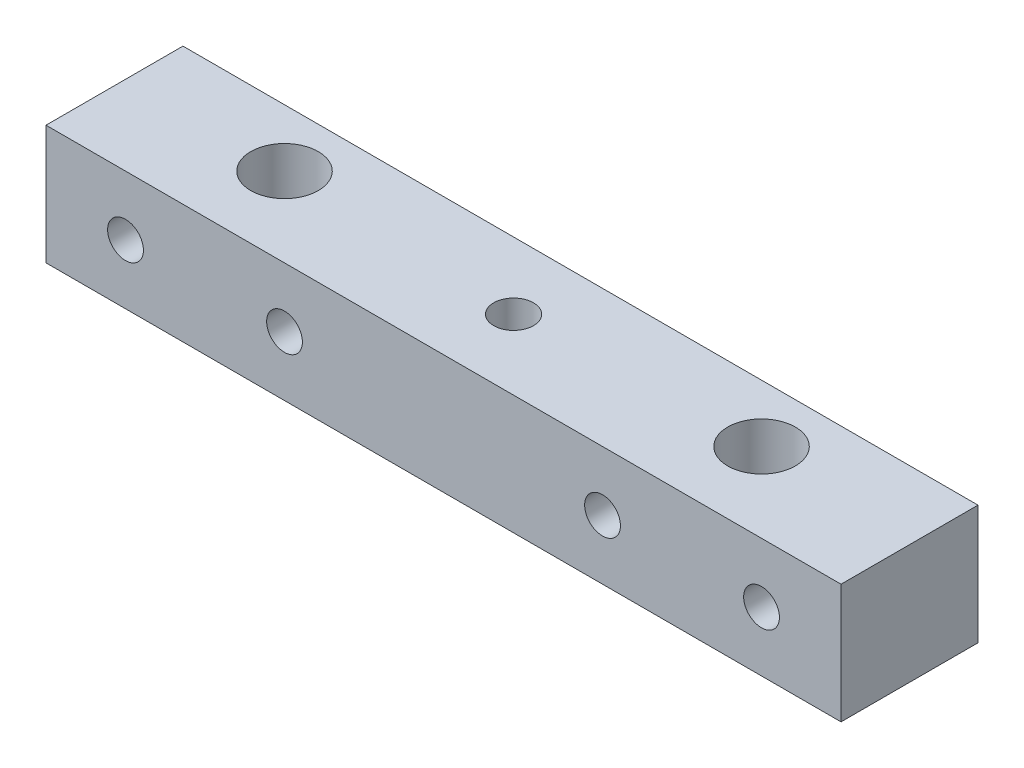
ISO-10303-21;
HEADER;
FILE_DESCRIPTION(('STEP AP214'),'2;1');
FILE_NAME('part.step','',(''),(''),'','','');
FILE_SCHEMA(('AUTOMOTIVE_DESIGN { 1 0 10303 214 1 1 1 1 }'));
ENDSEC;
DATA;
#1=APPLICATION_CONTEXT('core data for automotive mechanical design processes');
#2=APPLICATION_PROTOCOL_DEFINITION('international standard','automotive_design',2000,#1);
#3=PRODUCT_CONTEXT('',#1,'mechanical');
#4=PRODUCT('Part','Part','',(#3));
#5=PRODUCT_RELATED_PRODUCT_CATEGORY('part','',(#4));
#6=PRODUCT_DEFINITION_FORMATION('','',#4);
#7=PRODUCT_DEFINITION_CONTEXT('part definition',#1,'design');
#8=PRODUCT_DEFINITION('design','',#6,#7);
#9=PRODUCT_DEFINITION_SHAPE('','',#8);
#10=(LENGTH_UNIT() NAMED_UNIT(*) SI_UNIT(.MILLI.,.METRE.));
#11=(NAMED_UNIT(*) PLANE_ANGLE_UNIT() SI_UNIT($,.RADIAN.));
#12=(NAMED_UNIT(*) SI_UNIT($,.STERADIAN.) SOLID_ANGLE_UNIT());
#13=UNCERTAINTY_MEASURE_WITH_UNIT(LENGTH_MEASURE(1.E-05),#10,'distance_accuracy_value','');
#14=(GEOMETRIC_REPRESENTATION_CONTEXT(3) GLOBAL_UNCERTAINTY_ASSIGNED_CONTEXT((#13)) GLOBAL_UNIT_ASSIGNED_CONTEXT((#10,
#11,#12)) REPRESENTATION_CONTEXT('',''));
#15=CARTESIAN_POINT('',(0.,0.,0.));
#16=DIRECTION('',(0.,0.,1.));
#17=DIRECTION('',(1.,0.,0.));
#18=AXIS2_PLACEMENT_3D('',#15,#16,#17);
#19=CARTESIAN_POINT('',(-50.,15.,8.614));
#20=DIRECTION('',(0.,0.,-1.));
#21=DIRECTION('',(-1.,0.,0.));
#22=AXIS2_PLACEMENT_3D('',#19,#20,#21);
#23=PLANE('',#22);
#24=CARTESIAN_POINT('',(-20.,7.5,8.614));
#25=DIRECTION('',(0.,0.,1.));
#26=DIRECTION('',(1.,0.,0.));
#27=AXIS2_PLACEMENT_3D('',#24,#25,#26);
#28=CIRCLE('',#27,2.25);
#29=CARTESIAN_POINT('',(-17.75,7.5,8.614));
#30=VERTEX_POINT('',#29);
#31=EDGE_CURVE('E188',#30,#30,#28,.T.);
#32=ORIENTED_EDGE('',*,*,#31,.F.);
#33=EDGE_LOOP('',(#32));
#34=FACE_BOUND('',#33,.T.);
#35=CARTESIAN_POINT('',(20.,7.5,8.614));
#36=DIRECTION('',(0.,0.,1.));
#37=DIRECTION('',(1.,0.,0.));
#38=AXIS2_PLACEMENT_3D('',#35,#36,#37);
#39=CIRCLE('',#38,2.25);
#40=CARTESIAN_POINT('',(22.25,7.5,8.614));
#41=VERTEX_POINT('',#40);
#42=EDGE_CURVE('E180',#41,#41,#39,.T.);
#43=ORIENTED_EDGE('',*,*,#42,.F.);
#44=EDGE_LOOP('',(#43));
#45=FACE_BOUND('',#44,.T.);
#46=CARTESIAN_POINT('',(-40.,7.5,8.614));
#47=DIRECTION('',(0.,0.,1.));
#48=DIRECTION('',(1.,0.,0.));
#49=AXIS2_PLACEMENT_3D('',#46,#47,#48);
#50=CIRCLE('',#49,2.25);
#51=CARTESIAN_POINT('',(-37.75,7.5,8.614));
#52=VERTEX_POINT('',#51);
#53=EDGE_CURVE('E172',#52,#52,#50,.T.);
#54=ORIENTED_EDGE('',*,*,#53,.F.);
#55=EDGE_LOOP('',(#54));
#56=FACE_BOUND('',#55,.T.);
#57=DIRECTION('',(1.,0.,0.));
#58=VECTOR('',#57,1.);
#59=CARTESIAN_POINT('',(-50.,0.,8.614));
#60=LINE('',#59,#58);
#61=CARTESIAN_POINT('',(-50.,0.,8.614));
#62=VERTEX_POINT('',#61);
#63=CARTESIAN_POINT('',(50.,0.,8.614));
#64=VERTEX_POINT('',#63);
#65=EDGE_CURVE('E80',#62,#64,#60,.T.);
#66=ORIENTED_EDGE('',*,*,#65,.T.);
#67=DIRECTION('',(0.,-1.,0.));
#68=VECTOR('',#67,1.);
#69=CARTESIAN_POINT('',(50.,15.,8.614));
#70=LINE('',#69,#68);
#71=CARTESIAN_POINT('',(50.,15.,8.614));
#72=VERTEX_POINT('',#71);
#73=EDGE_CURVE('E104',#72,#64,#70,.T.);
#74=ORIENTED_EDGE('',*,*,#73,.F.);
#75=DIRECTION('',(1.,0.,0.));
#76=VECTOR('',#75,1.);
#77=CARTESIAN_POINT('',(-50.,15.,8.614));
#78=LINE('',#77,#76);
#79=CARTESIAN_POINT('',(-50.,15.,8.614));
#80=VERTEX_POINT('',#79);
#81=EDGE_CURVE('E57',#80,#72,#78,.T.);
#82=ORIENTED_EDGE('',*,*,#81,.F.);
#83=DIRECTION('',(0.,-1.,0.));
#84=VECTOR('',#83,1.);
#85=CARTESIAN_POINT('',(-50.,15.,8.614));
#86=LINE('',#85,#84);
#87=EDGE_CURVE('E99',#80,#62,#86,.T.);
#88=ORIENTED_EDGE('',*,*,#87,.T.);
#89=EDGE_LOOP('',(#66,#74,#82,#88));
#90=FACE_BOUND('',#89,.T.);
#91=CARTESIAN_POINT('',(40.,7.5,8.614));
#92=DIRECTION('',(0.,0.,1.));
#93=DIRECTION('',(1.,0.,0.));
#94=AXIS2_PLACEMENT_3D('',#91,#92,#93);
#95=CIRCLE('',#94,2.25);
#96=CARTESIAN_POINT('',(42.25,7.5,8.614));
#97=VERTEX_POINT('',#96);
#98=EDGE_CURVE('E164',#97,#97,#95,.T.);
#99=ORIENTED_EDGE('',*,*,#98,.F.);
#100=EDGE_LOOP('',(#99));
#101=FACE_BOUND('',#100,.T.);
#102=ADVANCED_FACE('F39',(#34,#45,#56,#90,#101),#23,.F.);
#103=CARTESIAN_POINT('',(50.,15.,8.614));
#104=DIRECTION('',(-1.,0.,0.));
#105=DIRECTION('',(0.,0.,1.));
#106=AXIS2_PLACEMENT_3D('',#103,#104,#105);
#107=PLANE('',#106);
#108=DIRECTION('',(0.,0.,-1.));
#109=VECTOR('',#108,1.);
#110=CARTESIAN_POINT('',(50.,0.,8.614));
#111=LINE('',#110,#109);
#112=CARTESIAN_POINT('',(50.,0.,-8.614));
#113=VERTEX_POINT('',#112);
#114=EDGE_CURVE('E108',#64,#113,#111,.T.);
#115=ORIENTED_EDGE('',*,*,#114,.T.);
#116=DIRECTION('',(0.,-1.,0.));
#117=VECTOR('',#116,1.);
#118=CARTESIAN_POINT('',(50.,15.,-8.614));
#119=LINE('',#118,#117);
#120=CARTESIAN_POINT('',(50.,15.,-8.614));
#121=VERTEX_POINT('',#120);
#122=EDGE_CURVE('E11',#121,#113,#119,.T.);
#123=ORIENTED_EDGE('',*,*,#122,.F.);
#124=DIRECTION('',(0.,0.,-1.));
#125=VECTOR('',#124,1.);
#126=CARTESIAN_POINT('',(50.,15.,8.614));
#127=LINE('',#126,#125);
#128=EDGE_CURVE('E92',#72,#121,#127,.T.);
#129=ORIENTED_EDGE('',*,*,#128,.F.);
#130=ORIENTED_EDGE('',*,*,#73,.T.);
#131=EDGE_LOOP('',(#115,#123,#129,#130));
#132=FACE_BOUND('',#131,.T.);
#133=ADVANCED_FACE('F41',(#132),#107,.F.);
#134=CARTESIAN_POINT('',(-50.,15.,-8.614));
#135=DIRECTION('',(0.,0.,1.));
#136=DIRECTION('',(1.,0.,0.));
#137=AXIS2_PLACEMENT_3D('',#134,#135,#136);
#138=PLANE('',#137);
#139=CARTESIAN_POINT('',(-20.,7.5,-8.614));
#140=DIRECTION('',(0.,0.,1.));
#141=DIRECTION('',(1.,0.,0.));
#142=AXIS2_PLACEMENT_3D('',#139,#140,#141);
#143=CIRCLE('',#142,2.25);
#144=CARTESIAN_POINT('',(-17.75,7.5,-8.614));
#145=VERTEX_POINT('',#144);
#146=EDGE_CURVE('E184',#145,#145,#143,.T.);
#147=ORIENTED_EDGE('',*,*,#146,.T.);
#148=EDGE_LOOP('',(#147));
#149=FACE_BOUND('',#148,.T.);
#150=CARTESIAN_POINT('',(20.,7.5,-8.614));
#151=DIRECTION('',(0.,0.,1.));
#152=DIRECTION('',(1.,0.,0.));
#153=AXIS2_PLACEMENT_3D('',#150,#151,#152);
#154=CIRCLE('',#153,2.25);
#155=CARTESIAN_POINT('',(22.25,7.5,-8.614));
#156=VERTEX_POINT('',#155);
#157=EDGE_CURVE('E176',#156,#156,#154,.T.);
#158=ORIENTED_EDGE('',*,*,#157,.T.);
#159=EDGE_LOOP('',(#158));
#160=FACE_BOUND('',#159,.T.);
#161=CARTESIAN_POINT('',(-40.,7.5,-8.614));
#162=DIRECTION('',(0.,0.,1.));
#163=DIRECTION('',(1.,0.,0.));
#164=AXIS2_PLACEMENT_3D('',#161,#162,#163);
#165=CIRCLE('',#164,2.25);
#166=CARTESIAN_POINT('',(-37.75,7.5,-8.614));
#167=VERTEX_POINT('',#166);
#168=EDGE_CURVE('E168',#167,#167,#165,.T.);
#169=ORIENTED_EDGE('',*,*,#168,.T.);
#170=EDGE_LOOP('',(#169));
#171=FACE_BOUND('',#170,.T.);
#172=CARTESIAN_POINT('',(40.,7.5,-8.614));
#173=DIRECTION('',(0.,0.,1.));
#174=DIRECTION('',(1.,0.,0.));
#175=AXIS2_PLACEMENT_3D('',#172,#173,#174);
#176=CIRCLE('',#175,2.25);
#177=CARTESIAN_POINT('',(42.25,7.5,-8.614));
#178=VERTEX_POINT('',#177);
#179=EDGE_CURVE('E160',#178,#178,#176,.T.);
#180=ORIENTED_EDGE('',*,*,#179,.T.);
#181=EDGE_LOOP('',(#180));
#182=FACE_BOUND('',#181,.T.);
#183=DIRECTION('',(-1.,0.,0.));
#184=VECTOR('',#183,1.);
#185=CARTESIAN_POINT('',(-50.,0.,-8.614));
#186=LINE('',#185,#184);
#187=CARTESIAN_POINT('',(-50.,0.,-8.614));
#188=VERTEX_POINT('',#187);
#189=EDGE_CURVE('E97',#113,#188,#186,.T.);
#190=ORIENTED_EDGE('',*,*,#189,.T.);
#191=DIRECTION('',(0.,-1.,0.));
#192=VECTOR('',#191,1.);
#193=CARTESIAN_POINT('',(-50.,15.,-8.614));
#194=LINE('',#193,#192);
#195=CARTESIAN_POINT('',(-50.,15.,-8.614));
#196=VERTEX_POINT('',#195);
#197=EDGE_CURVE('E49',#196,#188,#194,.T.);
#198=ORIENTED_EDGE('',*,*,#197,.F.);
#199=DIRECTION('',(-1.,0.,0.));
#200=VECTOR('',#199,1.);
#201=CARTESIAN_POINT('',(-50.,15.,-8.614));
#202=LINE('',#201,#200);
#203=EDGE_CURVE('E87',#121,#196,#202,.T.);
#204=ORIENTED_EDGE('',*,*,#203,.F.);
#205=ORIENTED_EDGE('',*,*,#122,.T.);
#206=EDGE_LOOP('',(#190,#198,#204,#205));
#207=FACE_BOUND('',#206,.T.);
#208=ADVANCED_FACE('F96',(#149,#160,#171,#182,#207),#138,.F.);
#209=CARTESIAN_POINT('',(-50.,15.,8.614));
#210=DIRECTION('',(1.,0.,0.));
#211=DIRECTION('',(0.,0.,-1.));
#212=AXIS2_PLACEMENT_3D('',#209,#210,#211);
#213=PLANE('',#212);
#214=DIRECTION('',(0.,0.,1.));
#215=VECTOR('',#214,1.);
#216=CARTESIAN_POINT('',(-50.,0.,8.614));
#217=LINE('',#216,#215);
#218=EDGE_CURVE('E74',#188,#62,#217,.T.);
#219=ORIENTED_EDGE('',*,*,#218,.T.);
#220=ORIENTED_EDGE('',*,*,#87,.F.);
#221=DIRECTION('',(0.,0.,1.));
#222=VECTOR('',#221,1.);
#223=CARTESIAN_POINT('',(-50.,15.,8.614));
#224=LINE('',#223,#222);
#225=EDGE_CURVE('E90',#196,#80,#224,.T.);
#226=ORIENTED_EDGE('',*,*,#225,.F.);
#227=ORIENTED_EDGE('',*,*,#197,.T.);
#228=EDGE_LOOP('',(#219,#220,#226,#227));
#229=FACE_BOUND('',#228,.T.);
#230=ADVANCED_FACE('F100',(#229),#213,.F.);
#231=CARTESIAN_POINT('',(0.,15.,0.));
#232=DIRECTION('',(0.,-1.,0.));
#233=DIRECTION('',(0.,0.,-1.));
#234=AXIS2_PLACEMENT_3D('',#231,#232,#233);
#235=PLANE('',#234);
#236=CARTESIAN_POINT('',(0.,15.,-0.2));
#237=DIRECTION('',(0.,1.,0.));
#238=DIRECTION('',(0.,0.,1.));
#239=AXIS2_PLACEMENT_3D('',#236,#237,#238);
#240=CIRCLE('',#239,2.5);
#241=CARTESIAN_POINT('',(0.,15.,2.3));
#242=VERTEX_POINT('',#241);
#243=EDGE_CURVE('E204',#242,#242,#240,.T.);
#244=ORIENTED_EDGE('',*,*,#243,.F.);
#245=EDGE_LOOP('',(#244));
#246=FACE_BOUND('',#245,.T.);
#247=CARTESIAN_POINT('',(-30.,15.,-1.386));
#248=DIRECTION('',(0.,1.,0.));
#249=DIRECTION('',(0.,0.,1.));
#250=AXIS2_PLACEMENT_3D('',#247,#248,#249);
#251=CIRCLE('',#250,4.24999999999999);
#252=CARTESIAN_POINT('',(-30.,15.,2.86399999999999));
#253=VERTEX_POINT('',#252);
#254=EDGE_CURVE('E156',#253,#253,#251,.T.);
#255=ORIENTED_EDGE('',*,*,#254,.F.);
#256=EDGE_LOOP('',(#255));
#257=FACE_BOUND('',#256,.T.);
#258=CARTESIAN_POINT('',(30.,15.,-1.386));
#259=DIRECTION('',(0.,1.,0.));
#260=DIRECTION('',(0.,0.,1.));
#261=AXIS2_PLACEMENT_3D('',#258,#259,#260);
#262=CIRCLE('',#261,4.24999999999999);
#263=CARTESIAN_POINT('',(30.,15.,2.86399999999999));
#264=VERTEX_POINT('',#263);
#265=EDGE_CURVE('E140',#264,#264,#262,.T.);
#266=ORIENTED_EDGE('',*,*,#265,.F.);
#267=EDGE_LOOP('',(#266));
#268=FACE_BOUND('',#267,.T.);
#269=ORIENTED_EDGE('',*,*,#128,.T.);
#270=ORIENTED_EDGE('',*,*,#203,.T.);
#271=ORIENTED_EDGE('',*,*,#225,.T.);
#272=ORIENTED_EDGE('',*,*,#81,.T.);
#273=EDGE_LOOP('',(#269,#270,#271,#272));
#274=FACE_BOUND('',#273,.T.);
#275=ADVANCED_FACE('F88',(#246,#257,#268,#274),#235,.F.);
#276=CARTESIAN_POINT('',(0.,0.,0.));
#277=DIRECTION('',(0.,-1.,0.));
#278=DIRECTION('',(0.,0.,-1.));
#279=AXIS2_PLACEMENT_3D('',#276,#277,#278);
#280=PLANE('',#279);
#281=CARTESIAN_POINT('',(0.,0.,-0.2));
#282=DIRECTION('',(0.,1.,0.));
#283=DIRECTION('',(0.,0.,1.));
#284=AXIS2_PLACEMENT_3D('',#281,#282,#283);
#285=CIRCLE('',#284,2.25);
#286=CARTESIAN_POINT('',(0.,0.,2.05));
#287=VERTEX_POINT('',#286);
#288=EDGE_CURVE('E192',#287,#287,#285,.T.);
#289=ORIENTED_EDGE('',*,*,#288,.T.);
#290=EDGE_LOOP('',(#289));
#291=FACE_BOUND('',#290,.T.);
#292=CARTESIAN_POINT('',(-30.,0.,-1.386));
#293=DIRECTION('',(0.,1.,0.));
#294=DIRECTION('',(0.,0.,1.));
#295=AXIS2_PLACEMENT_3D('',#292,#293,#294);
#296=CIRCLE('',#295,2.25);
#297=CARTESIAN_POINT('',(-30.,0.,0.863999999999995));
#298=VERTEX_POINT('',#297);
#299=EDGE_CURVE('E144',#298,#298,#296,.T.);
#300=ORIENTED_EDGE('',*,*,#299,.T.);
#301=EDGE_LOOP('',(#300));
#302=FACE_BOUND('',#301,.T.);
#303=CARTESIAN_POINT('',(30.,0.,-1.386));
#304=DIRECTION('',(0.,1.,0.));
#305=DIRECTION('',(0.,0.,1.));
#306=AXIS2_PLACEMENT_3D('',#303,#304,#305);
#307=CIRCLE('',#306,2.25);
#308=CARTESIAN_POINT('',(30.,0.,0.863999999999995));
#309=VERTEX_POINT('',#308);
#310=EDGE_CURVE('E112',#309,#309,#307,.T.);
#311=ORIENTED_EDGE('',*,*,#310,.T.);
#312=EDGE_LOOP('',(#311));
#313=FACE_BOUND('',#312,.T.);
#314=ORIENTED_EDGE('',*,*,#114,.F.);
#315=ORIENTED_EDGE('',*,*,#65,.F.);
#316=ORIENTED_EDGE('',*,*,#218,.F.);
#317=ORIENTED_EDGE('',*,*,#189,.F.);
#318=EDGE_LOOP('',(#314,#315,#316,#317));
#319=FACE_BOUND('',#318,.T.);
#320=ADVANCED_FACE('F125',(#291,#302,#313,#319),#280,.T.);
#321=CARTESIAN_POINT('',(30.,15.,-1.386));
#322=DIRECTION('',(0.,1.,0.));
#323=DIRECTION('',(0.,0.,1.));
#324=AXIS2_PLACEMENT_3D('',#321,#322,#323);
#325=CYLINDRICAL_SURFACE('',#324,2.25);
#326=ORIENTED_EDGE('',*,*,#310,.F.);
#327=EDGE_LOOP('',(#326));
#328=FACE_BOUND('',#327,.T.);
#329=CARTESIAN_POINT('',(30.,9.,-1.386));
#330=DIRECTION('',(0.,1.,0.));
#331=DIRECTION('',(0.,0.,1.));
#332=AXIS2_PLACEMENT_3D('',#329,#330,#331);
#333=CIRCLE('',#332,2.25);
#334=CARTESIAN_POINT('',(30.,9.,0.864000000000002));
#335=VERTEX_POINT('',#334);
#336=EDGE_CURVE('E132',#335,#335,#333,.T.);
#337=ORIENTED_EDGE('',*,*,#336,.T.);
#338=EDGE_LOOP('',(#337));
#339=FACE_BOUND('',#338,.T.);
#340=ADVANCED_FACE('F231',(#328,#339),#325,.F.);
#341=CARTESIAN_POINT('',(32.25,9.,-1.386));
#342=DIRECTION('',(0.,-1.,0.));
#343=DIRECTION('',(0.,0.,-1.));
#344=AXIS2_PLACEMENT_3D('',#341,#342,#343);
#345=PLANE('',#344);
#346=ORIENTED_EDGE('',*,*,#336,.F.);
#347=EDGE_LOOP('',(#346));
#348=FACE_BOUND('',#347,.T.);
#349=CARTESIAN_POINT('',(30.,9.,-1.386));
#350=DIRECTION('',(0.,1.,0.));
#351=DIRECTION('',(0.,0.,1.));
#352=AXIS2_PLACEMENT_3D('',#349,#350,#351);
#353=CIRCLE('',#352,4.25);
#354=CARTESIAN_POINT('',(30.,9.,2.864));
#355=VERTEX_POINT('',#354);
#356=EDGE_CURVE('E136',#355,#355,#353,.T.);
#357=ORIENTED_EDGE('',*,*,#356,.T.);
#358=EDGE_LOOP('',(#357));
#359=FACE_BOUND('',#358,.T.);
#360=ADVANCED_FACE('F221',(#348,#359),#345,.F.);
#361=CARTESIAN_POINT('',(30.,15.,-1.386));
#362=DIRECTION('',(0.,1.,0.));
#363=DIRECTION('',(0.,0.,1.));
#364=AXIS2_PLACEMENT_3D('',#361,#362,#363);
#365=CYLINDRICAL_SURFACE('',#364,4.24999999999999);
#366=ORIENTED_EDGE('',*,*,#356,.F.);
#367=EDGE_LOOP('',(#366));
#368=FACE_BOUND('',#367,.T.);
#369=ORIENTED_EDGE('',*,*,#265,.T.);
#370=EDGE_LOOP('',(#369));
#371=FACE_BOUND('',#370,.T.);
#372=ADVANCED_FACE('F218',(#368,#371),#365,.F.);
#373=CARTESIAN_POINT('',(-30.,15.,-1.386));
#374=DIRECTION('',(0.,1.,0.));
#375=DIRECTION('',(0.,0.,1.));
#376=AXIS2_PLACEMENT_3D('',#373,#374,#375);
#377=CYLINDRICAL_SURFACE('',#376,2.25);
#378=ORIENTED_EDGE('',*,*,#299,.F.);
#379=EDGE_LOOP('',(#378));
#380=FACE_BOUND('',#379,.T.);
#381=CARTESIAN_POINT('',(-30.,9.,-1.386));
#382=DIRECTION('',(0.,1.,0.));
#383=DIRECTION('',(0.,0.,1.));
#384=AXIS2_PLACEMENT_3D('',#381,#382,#383);
#385=CIRCLE('',#384,2.25);
#386=CARTESIAN_POINT('',(-30.,9.,0.864000000000002));
#387=VERTEX_POINT('',#386);
#388=EDGE_CURVE('E148',#387,#387,#385,.T.);
#389=ORIENTED_EDGE('',*,*,#388,.T.);
#390=EDGE_LOOP('',(#389));
#391=FACE_BOUND('',#390,.T.);
#392=ADVANCED_FACE('F220',(#380,#391),#377,.F.);
#393=CARTESIAN_POINT('',(-27.75,9.,-1.386));
#394=DIRECTION('',(0.,-1.,0.));
#395=DIRECTION('',(0.,0.,-1.));
#396=AXIS2_PLACEMENT_3D('',#393,#394,#395);
#397=PLANE('',#396);
#398=ORIENTED_EDGE('',*,*,#388,.F.);
#399=EDGE_LOOP('',(#398));
#400=FACE_BOUND('',#399,.T.);
#401=CARTESIAN_POINT('',(-30.,9.,-1.386));
#402=DIRECTION('',(0.,1.,0.));
#403=DIRECTION('',(0.,0.,1.));
#404=AXIS2_PLACEMENT_3D('',#401,#402,#403);
#405=CIRCLE('',#404,4.25);
#406=CARTESIAN_POINT('',(-30.,9.,2.864));
#407=VERTEX_POINT('',#406);
#408=EDGE_CURVE('E152',#407,#407,#405,.T.);
#409=ORIENTED_EDGE('',*,*,#408,.T.);
#410=EDGE_LOOP('',(#409));
#411=FACE_BOUND('',#410,.T.);
#412=ADVANCED_FACE('F228',(#400,#411),#397,.F.);
#413=CARTESIAN_POINT('',(-30.,15.,-1.386));
#414=DIRECTION('',(0.,1.,0.));
#415=DIRECTION('',(0.,0.,1.));
#416=AXIS2_PLACEMENT_3D('',#413,#414,#415);
#417=CYLINDRICAL_SURFACE('',#416,4.24999999999999);
#418=ORIENTED_EDGE('',*,*,#408,.F.);
#419=EDGE_LOOP('',(#418));
#420=FACE_BOUND('',#419,.T.);
#421=ORIENTED_EDGE('',*,*,#254,.T.);
#422=EDGE_LOOP('',(#421));
#423=FACE_BOUND('',#422,.T.);
#424=ADVANCED_FACE('F262',(#420,#423),#417,.F.);
#425=CARTESIAN_POINT('',(40.,7.5,8.614));
#426=DIRECTION('',(0.,0.,1.));
#427=DIRECTION('',(1.,0.,0.));
#428=AXIS2_PLACEMENT_3D('',#425,#426,#427);
#429=CYLINDRICAL_SURFACE('',#428,2.25);
#430=ORIENTED_EDGE('',*,*,#179,.F.);
#431=EDGE_LOOP('',(#430));
#432=FACE_BOUND('',#431,.T.);
#433=ORIENTED_EDGE('',*,*,#98,.T.);
#434=EDGE_LOOP('',(#433));
#435=FACE_BOUND('',#434,.T.);
#436=ADVANCED_FACE('F258',(#432,#435),#429,.F.);
#437=CARTESIAN_POINT('',(-40.,7.5,8.614));
#438=DIRECTION('',(0.,0.,1.));
#439=DIRECTION('',(1.,0.,0.));
#440=AXIS2_PLACEMENT_3D('',#437,#438,#439);
#441=CYLINDRICAL_SURFACE('',#440,2.25);
#442=ORIENTED_EDGE('',*,*,#168,.F.);
#443=EDGE_LOOP('',(#442));
#444=FACE_BOUND('',#443,.T.);
#445=ORIENTED_EDGE('',*,*,#53,.T.);
#446=EDGE_LOOP('',(#445));
#447=FACE_BOUND('',#446,.T.);
#448=ADVANCED_FACE('F261',(#444,#447),#441,.F.);
#449=CARTESIAN_POINT('',(20.,7.5,8.614));
#450=DIRECTION('',(0.,0.,1.));
#451=DIRECTION('',(1.,0.,0.));
#452=AXIS2_PLACEMENT_3D('',#449,#450,#451);
#453=CYLINDRICAL_SURFACE('',#452,2.25);
#454=ORIENTED_EDGE('',*,*,#157,.F.);
#455=EDGE_LOOP('',(#454));
#456=FACE_BOUND('',#455,.T.);
#457=ORIENTED_EDGE('',*,*,#42,.T.);
#458=EDGE_LOOP('',(#457));
#459=FACE_BOUND('',#458,.T.);
#460=ADVANCED_FACE('F269',(#456,#459),#453,.F.);
#461=CARTESIAN_POINT('',(-20.,7.5,8.614));
#462=DIRECTION('',(0.,0.,1.));
#463=DIRECTION('',(1.,0.,0.));
#464=AXIS2_PLACEMENT_3D('',#461,#462,#463);
#465=CYLINDRICAL_SURFACE('',#464,2.25);
#466=ORIENTED_EDGE('',*,*,#146,.F.);
#467=EDGE_LOOP('',(#466));
#468=FACE_BOUND('',#467,.T.);
#469=ORIENTED_EDGE('',*,*,#31,.T.);
#470=EDGE_LOOP('',(#469));
#471=FACE_BOUND('',#470,.T.);
#472=ADVANCED_FACE('F320',(#468,#471),#465,.F.);
#473=CARTESIAN_POINT('',(0.,15.,-0.2));
#474=DIRECTION('',(0.,1.,0.));
#475=DIRECTION('',(0.,0.,1.));
#476=AXIS2_PLACEMENT_3D('',#473,#474,#475);
#477=CYLINDRICAL_SURFACE('',#476,2.25);
#478=ORIENTED_EDGE('',*,*,#288,.F.);
#479=EDGE_LOOP('',(#478));
#480=FACE_BOUND('',#479,.T.);
#481=CARTESIAN_POINT('',(0.,10.8,-0.2));
#482=DIRECTION('',(0.,1.,0.));
#483=DIRECTION('',(0.,0.,1.));
#484=AXIS2_PLACEMENT_3D('',#481,#482,#483);
#485=CIRCLE('',#484,2.25);
#486=CARTESIAN_POINT('',(0.,10.8,2.05));
#487=VERTEX_POINT('',#486);
#488=EDGE_CURVE('E196',#487,#487,#485,.T.);
#489=ORIENTED_EDGE('',*,*,#488,.T.);
#490=EDGE_LOOP('',(#489));
#491=FACE_BOUND('',#490,.T.);
#492=ADVANCED_FACE('F329',(#480,#491),#477,.F.);
#493=CARTESIAN_POINT('',(2.25,10.8,-0.2));
#494=DIRECTION('',(0.,-1.,0.));
#495=DIRECTION('',(0.,0.,-1.));
#496=AXIS2_PLACEMENT_3D('',#493,#494,#495);
#497=PLANE('',#496);
#498=ORIENTED_EDGE('',*,*,#488,.F.);
#499=EDGE_LOOP('',(#498));
#500=FACE_BOUND('',#499,.T.);
#501=CARTESIAN_POINT('',(0.,10.8,-0.2));
#502=DIRECTION('',(0.,1.,0.));
#503=DIRECTION('',(0.,0.,1.));
#504=AXIS2_PLACEMENT_3D('',#501,#502,#503);
#505=CIRCLE('',#504,2.5);
#506=CARTESIAN_POINT('',(0.,10.8,2.3));
#507=VERTEX_POINT('',#506);
#508=EDGE_CURVE('E200',#507,#507,#505,.T.);
#509=ORIENTED_EDGE('',*,*,#508,.T.);
#510=EDGE_LOOP('',(#509));
#511=FACE_BOUND('',#510,.T.);
#512=ADVANCED_FACE('F355',(#500,#511),#497,.F.);
#513=CARTESIAN_POINT('',(0.,15.,-0.2));
#514=DIRECTION('',(0.,1.,0.));
#515=DIRECTION('',(0.,0.,1.));
#516=AXIS2_PLACEMENT_3D('',#513,#514,#515);
#517=CYLINDRICAL_SURFACE('',#516,2.5);
#518=ORIENTED_EDGE('',*,*,#508,.F.);
#519=EDGE_LOOP('',(#518));
#520=FACE_BOUND('',#519,.T.);
#521=ORIENTED_EDGE('',*,*,#243,.T.);
#522=EDGE_LOOP('',(#521));
#523=FACE_BOUND('',#522,.T.);
#524=ADVANCED_FACE('F209',(#520,#523),#517,.F.);
#525=CLOSED_SHELL('',(#102,#133,#208,#230,#275,#320,#340,#360,#372,#392,#412,#424,#436,#448,
#460,#472,#492,#512,#524));
#526=MANIFOLD_SOLID_BREP('B2',#525);
#527=ADVANCED_BREP_SHAPE_REPRESENTATION('',(#18,#526),#14);
#528=SHAPE_DEFINITION_REPRESENTATION(#9,#527);
ENDSEC;
END-ISO-10303-21;
